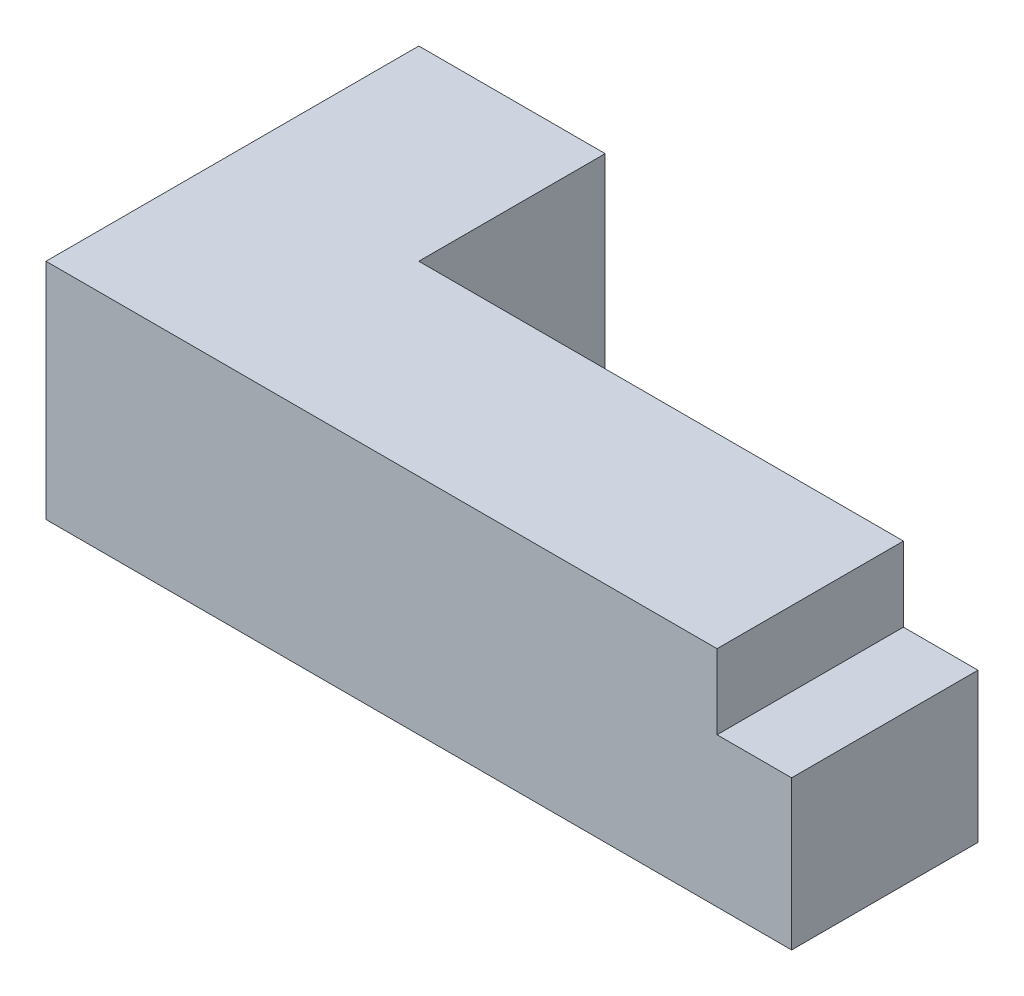
ISO-10303-21;
HEADER;
FILE_DESCRIPTION(('STEP AP214'),'2;1');
FILE_NAME('part.step','',(''),(''),'','','');
FILE_SCHEMA(('AUTOMOTIVE_DESIGN { 1 0 10303 214 1 1 1 1 }'));
ENDSEC;
DATA;
#1=APPLICATION_CONTEXT('core data for automotive mechanical design processes');
#2=APPLICATION_PROTOCOL_DEFINITION('international standard','automotive_design',2000,#1);
#3=PRODUCT_CONTEXT('',#1,'mechanical');
#4=PRODUCT('Part','Part','',(#3));
#5=PRODUCT_RELATED_PRODUCT_CATEGORY('part','',(#4));
#6=PRODUCT_DEFINITION_FORMATION('','',#4);
#7=PRODUCT_DEFINITION_CONTEXT('part definition',#1,'design');
#8=PRODUCT_DEFINITION('design','',#6,#7);
#9=PRODUCT_DEFINITION_SHAPE('','',#8);
#10=(LENGTH_UNIT() NAMED_UNIT(*) SI_UNIT(.MILLI.,.METRE.));
#11=(NAMED_UNIT(*) PLANE_ANGLE_UNIT() SI_UNIT($,.RADIAN.));
#12=(NAMED_UNIT(*) SI_UNIT($,.STERADIAN.) SOLID_ANGLE_UNIT());
#13=UNCERTAINTY_MEASURE_WITH_UNIT(LENGTH_MEASURE(1.E-05),#10,'distance_accuracy_value','');
#14=(GEOMETRIC_REPRESENTATION_CONTEXT(3) GLOBAL_UNCERTAINTY_ASSIGNED_CONTEXT((#13)) GLOBAL_UNIT_ASSIGNED_CONTEXT((#10,
#11,#12)) REPRESENTATION_CONTEXT('',''));
#15=CARTESIAN_POINT('',(0.,0.,0.));
#16=DIRECTION('',(0.,0.,1.));
#17=DIRECTION('',(1.,0.,0.));
#18=AXIS2_PLACEMENT_3D('',#15,#16,#17);
#19=CARTESIAN_POINT('',(100.,30.,0.));
#20=DIRECTION('',(1.,0.,0.));
#21=DIRECTION('',(0.,0.,-1.));
#22=AXIS2_PLACEMENT_3D('',#19,#20,#21);
#23=PLANE('',#22);
#24=DIRECTION('',(0.,0.,1.));
#25=VECTOR('',#24,1.);
#26=CARTESIAN_POINT('',(100.,20.,-50.001));
#27=LINE('',#26,#25);
#28=CARTESIAN_POINT('',(100.,20.,-25.));
#29=VERTEX_POINT('',#28);
#30=CARTESIAN_POINT('',(100.,20.,0.));
#31=VERTEX_POINT('',#30);
#32=EDGE_CURVE('E112',#29,#31,#27,.T.);
#33=ORIENTED_EDGE('',*,*,#32,.T.);
#34=DIRECTION('',(0.,-1.,0.));
#35=VECTOR('',#34,1.);
#36=CARTESIAN_POINT('',(100.,30.,0.));
#37=LINE('',#36,#35);
#38=CARTESIAN_POINT('',(100.,0.,0.));
#39=VERTEX_POINT('',#38);
#40=EDGE_CURVE('E89',#31,#39,#37,.T.);
#41=ORIENTED_EDGE('',*,*,#40,.T.);
#42=DIRECTION('',(0.,0.,1.));
#43=VECTOR('',#42,1.);
#44=CARTESIAN_POINT('',(100.,0.,0.));
#45=LINE('',#44,#43);
#46=CARTESIAN_POINT('',(100.,0.,-25.));
#47=VERTEX_POINT('',#46);
#48=EDGE_CURVE('E120',#47,#39,#45,.T.);
#49=ORIENTED_EDGE('',*,*,#48,.F.);
#50=DIRECTION('',(0.,-1.,0.));
#51=VECTOR('',#50,1.);
#52=CARTESIAN_POINT('',(100.,30.,-25.));
#53=LINE('',#52,#51);
#54=EDGE_CURVE('E11',#29,#47,#53,.T.);
#55=ORIENTED_EDGE('',*,*,#54,.F.);
#56=EDGE_LOOP('',(#33,#41,#49,#55));
#57=FACE_BOUND('',#56,.T.);
#58=ADVANCED_FACE('F38',(#57),#23,.T.);
#59=CARTESIAN_POINT('',(0.,30.,-25.));
#60=DIRECTION('',(0.,0.,-1.));
#61=DIRECTION('',(-1.,0.,0.));
#62=AXIS2_PLACEMENT_3D('',#59,#60,#61);
#63=PLANE('',#62);
#64=DIRECTION('',(1.,0.,0.));
#65=VECTOR('',#64,1.);
#66=CARTESIAN_POINT('',(100.,20.,-25.));
#67=LINE('',#66,#65);
#68=CARTESIAN_POINT('',(90.,20.,-25.));
#69=VERTEX_POINT('',#68);
#70=EDGE_CURVE('E115',#69,#29,#67,.T.);
#71=ORIENTED_EDGE('',*,*,#70,.T.);
#72=ORIENTED_EDGE('',*,*,#54,.T.);
#73=DIRECTION('',(1.,0.,0.));
#74=VECTOR('',#73,1.);
#75=CARTESIAN_POINT('',(0.,0.,-25.));
#76=LINE('',#75,#74);
#77=CARTESIAN_POINT('',(25.,0.,-25.));
#78=VERTEX_POINT('',#77);
#79=EDGE_CURVE('E132',#78,#47,#76,.T.);
#80=ORIENTED_EDGE('',*,*,#79,.F.);
#81=DIRECTION('',(0.,-1.,0.));
#82=VECTOR('',#81,1.);
#83=CARTESIAN_POINT('',(25.,30.,-25.));
#84=LINE('',#83,#82);
#85=CARTESIAN_POINT('',(25.,30.,-25.));
#86=VERTEX_POINT('',#85);
#87=EDGE_CURVE('E46',#86,#78,#84,.T.);
#88=ORIENTED_EDGE('',*,*,#87,.F.);
#89=DIRECTION('',(1.,0.,0.));
#90=VECTOR('',#89,1.);
#91=CARTESIAN_POINT('',(0.,30.,-25.));
#92=LINE('',#91,#90);
#93=CARTESIAN_POINT('',(90.,30.,-25.));
#94=VERTEX_POINT('',#93);
#95=EDGE_CURVE('E155',#86,#94,#92,.T.);
#96=ORIENTED_EDGE('',*,*,#95,.T.);
#97=DIRECTION('',(0.,-1.,0.));
#98=VECTOR('',#97,1.);
#99=CARTESIAN_POINT('',(90.,30.,-25.));
#100=LINE('',#99,#98);
#101=EDGE_CURVE('E53',#94,#69,#100,.T.);
#102=ORIENTED_EDGE('',*,*,#101,.T.);
#103=EDGE_LOOP('',(#71,#72,#80,#88,#96,#102));
#104=FACE_BOUND('',#103,.T.);
#105=ADVANCED_FACE('F123',(#104),#63,.T.);
#106=CARTESIAN_POINT('',(25.,30.,0.));
#107=DIRECTION('',(1.,0.,0.));
#108=DIRECTION('',(0.,0.,-1.));
#109=AXIS2_PLACEMENT_3D('',#106,#107,#108);
#110=PLANE('',#109);
#111=DIRECTION('',(0.,0.,1.));
#112=VECTOR('',#111,1.);
#113=CARTESIAN_POINT('',(25.,0.,0.));
#114=LINE('',#113,#112);
#115=CARTESIAN_POINT('',(25.,0.,-50.));
#116=VERTEX_POINT('',#115);
#117=EDGE_CURVE('E138',#116,#78,#114,.T.);
#118=ORIENTED_EDGE('',*,*,#117,.F.);
#119=DIRECTION('',(0.,-1.,0.));
#120=VECTOR('',#119,1.);
#121=CARTESIAN_POINT('',(25.,30.,-50.));
#122=LINE('',#121,#120);
#123=CARTESIAN_POINT('',(25.,30.,-50.));
#124=VERTEX_POINT('',#123);
#125=EDGE_CURVE('E164',#124,#116,#122,.T.);
#126=ORIENTED_EDGE('',*,*,#125,.F.);
#127=DIRECTION('',(0.,0.,1.));
#128=VECTOR('',#127,1.);
#129=CARTESIAN_POINT('',(25.,30.,0.));
#130=LINE('',#129,#128);
#131=EDGE_CURVE('E171',#124,#86,#130,.T.);
#132=ORIENTED_EDGE('',*,*,#131,.T.);
#133=ORIENTED_EDGE('',*,*,#87,.T.);
#134=EDGE_LOOP('',(#118,#126,#132,#133));
#135=FACE_BOUND('',#134,.T.);
#136=ADVANCED_FACE('F169',(#135),#110,.T.);
#137=CARTESIAN_POINT('',(0.,30.,-50.));
#138=DIRECTION('',(0.,0.,-1.));
#139=DIRECTION('',(-1.,0.,0.));
#140=AXIS2_PLACEMENT_3D('',#137,#138,#139);
#141=PLANE('',#140);
#142=DIRECTION('',(1.,0.,0.));
#143=VECTOR('',#142,1.);
#144=CARTESIAN_POINT('',(0.,0.,-50.));
#145=LINE('',#144,#143);
#146=CARTESIAN_POINT('',(0.,0.,-50.));
#147=VERTEX_POINT('',#146);
#148=EDGE_CURVE('E142',#147,#116,#145,.T.);
#149=ORIENTED_EDGE('',*,*,#148,.F.);
#150=DIRECTION('',(0.,-1.,0.));
#151=VECTOR('',#150,1.);
#152=CARTESIAN_POINT('',(0.,30.,-50.));
#153=LINE('',#152,#151);
#154=CARTESIAN_POINT('',(0.,30.,-50.));
#155=VERTEX_POINT('',#154);
#156=EDGE_CURVE('E161',#155,#147,#153,.T.);
#157=ORIENTED_EDGE('',*,*,#156,.F.);
#158=DIRECTION('',(1.,0.,0.));
#159=VECTOR('',#158,1.);
#160=CARTESIAN_POINT('',(0.,30.,-50.));
#161=LINE('',#160,#159);
#162=EDGE_CURVE('E176',#155,#124,#161,.T.);
#163=ORIENTED_EDGE('',*,*,#162,.T.);
#164=ORIENTED_EDGE('',*,*,#125,.T.);
#165=EDGE_LOOP('',(#149,#157,#163,#164));
#166=FACE_BOUND('',#165,.T.);
#167=ADVANCED_FACE('F220',(#166),#141,.T.);
#168=CARTESIAN_POINT('',(0.,30.,0.));
#169=DIRECTION('',(-1.,0.,0.));
#170=DIRECTION('',(0.,0.,1.));
#171=AXIS2_PLACEMENT_3D('',#168,#169,#170);
#172=PLANE('',#171);
#173=DIRECTION('',(0.,0.,-1.));
#174=VECTOR('',#173,1.);
#175=CARTESIAN_POINT('',(0.,0.,0.));
#176=LINE('',#175,#174);
#177=CARTESIAN_POINT('',(0.,0.,0.));
#178=VERTEX_POINT('',#177);
#179=EDGE_CURVE('E148',#178,#147,#176,.T.);
#180=ORIENTED_EDGE('',*,*,#179,.F.);
#181=DIRECTION('',(0.,-1.,0.));
#182=VECTOR('',#181,1.);
#183=CARTESIAN_POINT('',(0.,30.,0.));
#184=LINE('',#183,#182);
#185=CARTESIAN_POINT('',(0.,30.,0.));
#186=VERTEX_POINT('',#185);
#187=EDGE_CURVE('E62',#186,#178,#184,.T.);
#188=ORIENTED_EDGE('',*,*,#187,.F.);
#189=DIRECTION('',(0.,0.,-1.));
#190=VECTOR('',#189,1.);
#191=CARTESIAN_POINT('',(0.,30.,0.));
#192=LINE('',#191,#190);
#193=EDGE_CURVE('E180',#186,#155,#192,.T.);
#194=ORIENTED_EDGE('',*,*,#193,.T.);
#195=ORIENTED_EDGE('',*,*,#156,.T.);
#196=EDGE_LOOP('',(#180,#188,#194,#195));
#197=FACE_BOUND('',#196,.T.);
#198=ADVANCED_FACE('F225',(#197),#172,.T.);
#199=CARTESIAN_POINT('',(0.,30.,0.));
#200=DIRECTION('',(0.,0.,-1.));
#201=DIRECTION('',(-1.,0.,0.));
#202=AXIS2_PLACEMENT_3D('',#199,#200,#201);
#203=PLANE('',#202);
#204=ORIENTED_EDGE('',*,*,#40,.F.);
#205=DIRECTION('',(1.,0.,0.));
#206=VECTOR('',#205,1.);
#207=CARTESIAN_POINT('',(100.,20.,0.));
#208=LINE('',#207,#206);
#209=CARTESIAN_POINT('',(90.,20.,0.));
#210=VERTEX_POINT('',#209);
#211=EDGE_CURVE('E117',#210,#31,#208,.T.);
#212=ORIENTED_EDGE('',*,*,#211,.F.);
#213=DIRECTION('',(0.,-1.,0.));
#214=VECTOR('',#213,1.);
#215=CARTESIAN_POINT('',(90.,30.,0.));
#216=LINE('',#215,#214);
#217=CARTESIAN_POINT('',(90.,30.,0.));
#218=VERTEX_POINT('',#217);
#219=EDGE_CURVE('E125',#218,#210,#216,.T.);
#220=ORIENTED_EDGE('',*,*,#219,.F.);
#221=DIRECTION('',(1.,0.,0.));
#222=VECTOR('',#221,1.);
#223=CARTESIAN_POINT('',(0.,30.,0.));
#224=LINE('',#223,#222);
#225=EDGE_CURVE('E158',#186,#218,#224,.T.);
#226=ORIENTED_EDGE('',*,*,#225,.F.);
#227=ORIENTED_EDGE('',*,*,#187,.T.);
#228=DIRECTION('',(1.,0.,0.));
#229=VECTOR('',#228,1.);
#230=CARTESIAN_POINT('',(0.,0.,0.));
#231=LINE('',#230,#229);
#232=EDGE_CURVE('E152',#178,#39,#231,.T.);
#233=ORIENTED_EDGE('',*,*,#232,.T.);
#234=EDGE_LOOP('',(#204,#212,#220,#226,#227,#233));
#235=FACE_BOUND('',#234,.T.);
#236=ADVANCED_FACE('F193',(#235),#203,.F.);
#237=CARTESIAN_POINT('',(0.,30.,0.));
#238=DIRECTION('',(0.,1.,0.));
#239=DIRECTION('',(0.,0.,1.));
#240=AXIS2_PLACEMENT_3D('',#237,#238,#239);
#241=PLANE('',#240);
#242=DIRECTION('',(0.,0.,1.));
#243=VECTOR('',#242,1.);
#244=CARTESIAN_POINT('',(90.,30.,-50.001));
#245=LINE('',#244,#243);
#246=EDGE_CURVE('E190',#94,#218,#245,.T.);
#247=ORIENTED_EDGE('',*,*,#246,.F.);
#248=ORIENTED_EDGE('',*,*,#95,.F.);
#249=ORIENTED_EDGE('',*,*,#131,.F.);
#250=ORIENTED_EDGE('',*,*,#162,.F.);
#251=ORIENTED_EDGE('',*,*,#193,.F.);
#252=ORIENTED_EDGE('',*,*,#225,.T.);
#253=EDGE_LOOP('',(#247,#248,#249,#250,#251,#252));
#254=FACE_BOUND('',#253,.T.);
#255=ADVANCED_FACE('F189',(#254),#241,.T.);
#256=CARTESIAN_POINT('',(0.,0.,0.));
#257=DIRECTION('',(0.,1.,0.));
#258=DIRECTION('',(0.,0.,1.));
#259=AXIS2_PLACEMENT_3D('',#256,#257,#258);
#260=PLANE('',#259);
#261=ORIENTED_EDGE('',*,*,#48,.T.);
#262=ORIENTED_EDGE('',*,*,#232,.F.);
#263=ORIENTED_EDGE('',*,*,#179,.T.);
#264=ORIENTED_EDGE('',*,*,#148,.T.);
#265=ORIENTED_EDGE('',*,*,#117,.T.);
#266=ORIENTED_EDGE('',*,*,#79,.T.);
#267=EDGE_LOOP('',(#261,#262,#263,#264,#265,#266));
#268=FACE_BOUND('',#267,.T.);
#269=ADVANCED_FACE('F135',(#268),#260,.F.);
#270=CARTESIAN_POINT('',(100.,20.,-50.001));
#271=DIRECTION('',(0.,-1.,0.));
#272=DIRECTION('',(1.,0.,0.));
#273=AXIS2_PLACEMENT_3D('',#270,#271,#272);
#274=PLANE('',#273);
#275=DIRECTION('',(0.,0.,1.));
#276=VECTOR('',#275,1.);
#277=CARTESIAN_POINT('',(90.,20.,-50.001));
#278=LINE('',#277,#276);
#279=EDGE_CURVE('E121',#69,#210,#278,.T.);
#280=ORIENTED_EDGE('',*,*,#279,.T.);
#281=ORIENTED_EDGE('',*,*,#211,.T.);
#282=ORIENTED_EDGE('',*,*,#32,.F.);
#283=ORIENTED_EDGE('',*,*,#70,.F.);
#284=EDGE_LOOP('',(#280,#281,#282,#283));
#285=FACE_BOUND('',#284,.T.);
#286=ADVANCED_FACE('F114',(#285),#274,.F.);
#287=CARTESIAN_POINT('',(90.,30.,-50.001));
#288=DIRECTION('',(-1.,0.,0.));
#289=DIRECTION('',(0.,0.,1.));
#290=AXIS2_PLACEMENT_3D('',#287,#288,#289);
#291=PLANE('',#290);
#292=ORIENTED_EDGE('',*,*,#246,.T.);
#293=ORIENTED_EDGE('',*,*,#219,.T.);
#294=ORIENTED_EDGE('',*,*,#279,.F.);
#295=ORIENTED_EDGE('',*,*,#101,.F.);
#296=EDGE_LOOP('',(#292,#293,#294,#295));
#297=FACE_BOUND('',#296,.T.);
#298=ADVANCED_FACE('F203',(#297),#291,.F.);
#299=CLOSED_SHELL('',(#58,#105,#136,#167,#198,#236,#255,#269,#286,#298));
#300=MANIFOLD_SOLID_BREP('B2',#299);
#301=ADVANCED_BREP_SHAPE_REPRESENTATION('',(#18,#300),#14);
#302=SHAPE_DEFINITION_REPRESENTATION(#9,#301);
ENDSEC;
END-ISO-10303-21;
